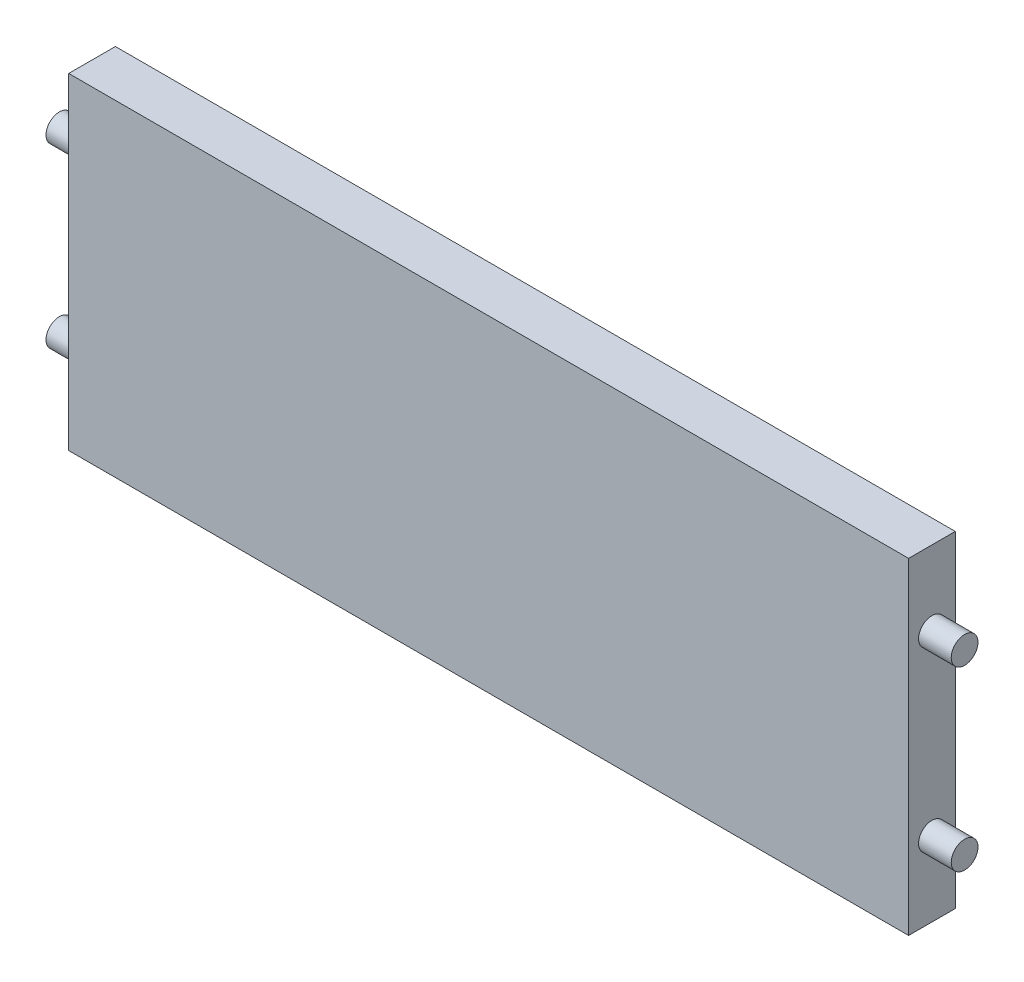
ISO-10303-21;
HEADER;
FILE_DESCRIPTION(('STEP AP214'),'2;1');
FILE_NAME('part.step','',(''),(''),'','','');
FILE_SCHEMA(('AUTOMOTIVE_DESIGN { 1 0 10303 214 1 1 1 1 }'));
ENDSEC;
DATA;
#1=APPLICATION_CONTEXT('core data for automotive mechanical design processes');
#2=APPLICATION_PROTOCOL_DEFINITION('international standard','automotive_design',2000,#1);
#3=PRODUCT_CONTEXT('',#1,'mechanical');
#4=PRODUCT('Part','Part','',(#3));
#5=PRODUCT_RELATED_PRODUCT_CATEGORY('part','',(#4));
#6=PRODUCT_DEFINITION_FORMATION('','',#4);
#7=PRODUCT_DEFINITION_CONTEXT('part definition',#1,'design');
#8=PRODUCT_DEFINITION('design','',#6,#7);
#9=PRODUCT_DEFINITION_SHAPE('','',#8);
#10=(LENGTH_UNIT() NAMED_UNIT(*) SI_UNIT(.MILLI.,.METRE.));
#11=(NAMED_UNIT(*) PLANE_ANGLE_UNIT() SI_UNIT($,.RADIAN.));
#12=(NAMED_UNIT(*) SI_UNIT($,.STERADIAN.) SOLID_ANGLE_UNIT());
#13=UNCERTAINTY_MEASURE_WITH_UNIT(LENGTH_MEASURE(1.E-05),#10,'distance_accuracy_value','');
#14=(GEOMETRIC_REPRESENTATION_CONTEXT(3) GLOBAL_UNCERTAINTY_ASSIGNED_CONTEXT((#13)) GLOBAL_UNIT_ASSIGNED_CONTEXT((#10,
#11,#12)) REPRESENTATION_CONTEXT('',''));
#15=CARTESIAN_POINT('',(0.,0.,0.));
#16=DIRECTION('',(0.,0.,1.));
#17=DIRECTION('',(1.,0.,0.));
#18=AXIS2_PLACEMENT_3D('',#15,#16,#17);
#19=CARTESIAN_POINT('',(0.,-17.5,5.));
#20=DIRECTION('',(0.,1.,0.));
#21=DIRECTION('',(0.,0.,1.));
#22=AXIS2_PLACEMENT_3D('',#19,#20,#21);
#23=PLANE('',#22);
#24=DIRECTION('',(1.,0.,0.));
#25=VECTOR('',#24,1.);
#26=CARTESIAN_POINT('',(0.,-17.5,0.));
#27=LINE('',#26,#25);
#28=CARTESIAN_POINT('',(-45.,-17.5,0.));
#29=VERTEX_POINT('',#28);
#30=CARTESIAN_POINT('',(45.,-17.5,0.));
#31=VERTEX_POINT('',#30);
#32=EDGE_CURVE('E117',#29,#31,#27,.T.);
#33=ORIENTED_EDGE('',*,*,#32,.T.);
#34=DIRECTION('',(0.,0.,-1.));
#35=VECTOR('',#34,1.);
#36=CARTESIAN_POINT('',(45.,-17.5,5.));
#37=LINE('',#36,#35);
#38=CARTESIAN_POINT('',(45.,-17.5,5.));
#39=VERTEX_POINT('',#38);
#40=EDGE_CURVE('E107',#39,#31,#37,.T.);
#41=ORIENTED_EDGE('',*,*,#40,.F.);
#42=DIRECTION('',(1.,0.,0.));
#43=VECTOR('',#42,1.);
#44=CARTESIAN_POINT('',(0.,-17.5,5.));
#45=LINE('',#44,#43);
#46=CARTESIAN_POINT('',(-45.,-17.5,5.));
#47=VERTEX_POINT('',#46);
#48=EDGE_CURVE('E96',#47,#39,#45,.T.);
#49=ORIENTED_EDGE('',*,*,#48,.F.);
#50=DIRECTION('',(0.,0.,-1.));
#51=VECTOR('',#50,1.);
#52=CARTESIAN_POINT('',(-45.,-17.5,5.));
#53=LINE('',#52,#51);
#54=EDGE_CURVE('E62',#47,#29,#53,.T.);
#55=ORIENTED_EDGE('',*,*,#54,.T.);
#56=EDGE_LOOP('',(#33,#41,#49,#55));
#57=FACE_BOUND('',#56,.T.);
#58=ADVANCED_FACE('F45',(#57),#23,.F.);
#59=CARTESIAN_POINT('',(45.,0.,5.));
#60=DIRECTION('',(-1.,0.,0.));
#61=DIRECTION('',(0.,0.,1.));
#62=AXIS2_PLACEMENT_3D('',#59,#60,#61);
#63=PLANE('',#62);
#64=CARTESIAN_POINT('',(45.,-9.5,2.5));
#65=DIRECTION('',(-1.,0.,0.));
#66=DIRECTION('',(0.,0.,1.));
#67=AXIS2_PLACEMENT_3D('',#64,#65,#66);
#68=CIRCLE('',#67,1.435);
#69=CARTESIAN_POINT('',(45.,-9.5,3.935));
#70=VERTEX_POINT('',#69);
#71=EDGE_CURVE('E11',#70,#70,#68,.F.);
#72=ORIENTED_EDGE('',*,*,#71,.F.);
#73=EDGE_LOOP('',(#72));
#74=FACE_BOUND('',#73,.T.);
#75=CARTESIAN_POINT('',(45.,9.5,2.5));
#76=DIRECTION('',(-1.,0.,0.));
#77=DIRECTION('',(0.,0.,1.));
#78=AXIS2_PLACEMENT_3D('',#75,#76,#77);
#79=CIRCLE('',#78,1.435);
#80=CARTESIAN_POINT('',(45.,9.5,3.935));
#81=VERTEX_POINT('',#80);
#82=EDGE_CURVE('E54',#81,#81,#79,.F.);
#83=ORIENTED_EDGE('',*,*,#82,.F.);
#84=EDGE_LOOP('',(#83));
#85=FACE_BOUND('',#84,.T.);
#86=DIRECTION('',(0.,1.,0.));
#87=VECTOR('',#86,1.);
#88=CARTESIAN_POINT('',(45.,0.,0.));
#89=LINE('',#88,#87);
#90=CARTESIAN_POINT('',(45.,17.5,0.));
#91=VERTEX_POINT('',#90);
#92=EDGE_CURVE('E103',#31,#91,#89,.T.);
#93=ORIENTED_EDGE('',*,*,#92,.T.);
#94=DIRECTION('',(0.,0.,-1.));
#95=VECTOR('',#94,1.);
#96=CARTESIAN_POINT('',(45.,17.5,5.));
#97=LINE('',#96,#95);
#98=CARTESIAN_POINT('',(45.,17.5,5.));
#99=VERTEX_POINT('',#98);
#100=EDGE_CURVE('E101',#99,#91,#97,.T.);
#101=ORIENTED_EDGE('',*,*,#100,.F.);
#102=DIRECTION('',(0.,1.,0.));
#103=VECTOR('',#102,1.);
#104=CARTESIAN_POINT('',(45.,0.,5.));
#105=LINE('',#104,#103);
#106=EDGE_CURVE('E88',#39,#99,#105,.T.);
#107=ORIENTED_EDGE('',*,*,#106,.F.);
#108=ORIENTED_EDGE('',*,*,#40,.T.);
#109=EDGE_LOOP('',(#93,#101,#107,#108));
#110=FACE_BOUND('',#109,.T.);
#111=ADVANCED_FACE('F102',(#74,#85,#110),#63,.F.);
#112=CARTESIAN_POINT('',(0.,17.5,5.));
#113=DIRECTION('',(0.,1.,0.));
#114=DIRECTION('',(0.,0.,1.));
#115=AXIS2_PLACEMENT_3D('',#112,#113,#114);
#116=PLANE('',#115);
#117=DIRECTION('',(1.,0.,0.));
#118=VECTOR('',#117,1.);
#119=CARTESIAN_POINT('',(0.,17.5,0.));
#120=LINE('',#119,#118);
#121=CARTESIAN_POINT('',(-45.,17.5,0.));
#122=VERTEX_POINT('',#121);
#123=EDGE_CURVE('E123',#122,#91,#120,.T.);
#124=ORIENTED_EDGE('',*,*,#123,.F.);
#125=DIRECTION('',(0.,0.,-1.));
#126=VECTOR('',#125,1.);
#127=CARTESIAN_POINT('',(-45.,17.5,5.));
#128=LINE('',#127,#126);
#129=CARTESIAN_POINT('',(-45.,17.5,5.));
#130=VERTEX_POINT('',#129);
#131=EDGE_CURVE('E76',#130,#122,#128,.T.);
#132=ORIENTED_EDGE('',*,*,#131,.F.);
#133=DIRECTION('',(1.,0.,0.));
#134=VECTOR('',#133,1.);
#135=CARTESIAN_POINT('',(0.,17.5,5.));
#136=LINE('',#135,#134);
#137=EDGE_CURVE('E95',#130,#99,#136,.T.);
#138=ORIENTED_EDGE('',*,*,#137,.T.);
#139=ORIENTED_EDGE('',*,*,#100,.T.);
#140=EDGE_LOOP('',(#124,#132,#138,#139));
#141=FACE_BOUND('',#140,.T.);
#142=ADVANCED_FACE('F109',(#141),#116,.T.);
#143=CARTESIAN_POINT('',(-45.,0.,5.));
#144=DIRECTION('',(-1.,0.,0.));
#145=DIRECTION('',(0.,0.,1.));
#146=AXIS2_PLACEMENT_3D('',#143,#144,#145);
#147=PLANE('',#146);
#148=CARTESIAN_POINT('',(-45.,-9.5,2.5));
#149=DIRECTION('',(-1.,0.,0.));
#150=DIRECTION('',(0.,0.,-1.));
#151=AXIS2_PLACEMENT_3D('',#148,#149,#150);
#152=CIRCLE('',#151,1.435);
#153=CARTESIAN_POINT('',(-45.,-9.5,1.065));
#154=VERTEX_POINT('',#153);
#155=EDGE_CURVE('E198',#154,#154,#152,.T.);
#156=ORIENTED_EDGE('',*,*,#155,.F.);
#157=EDGE_LOOP('',(#156));
#158=FACE_BOUND('',#157,.T.);
#159=CARTESIAN_POINT('',(-45.,9.5,2.5));
#160=DIRECTION('',(-1.,0.,0.));
#161=DIRECTION('',(0.,0.,1.));
#162=AXIS2_PLACEMENT_3D('',#159,#160,#161);
#163=CIRCLE('',#162,1.435);
#164=CARTESIAN_POINT('',(-45.,9.5,3.935));
#165=VERTEX_POINT('',#164);
#166=EDGE_CURVE('E200',#165,#165,#163,.T.);
#167=ORIENTED_EDGE('',*,*,#166,.F.);
#168=EDGE_LOOP('',(#167));
#169=FACE_BOUND('',#168,.T.);
#170=DIRECTION('',(0.,1.,0.));
#171=VECTOR('',#170,1.);
#172=CARTESIAN_POINT('',(-45.,0.,0.));
#173=LINE('',#172,#171);
#174=EDGE_CURVE('E126',#29,#122,#173,.T.);
#175=ORIENTED_EDGE('',*,*,#174,.F.);
#176=ORIENTED_EDGE('',*,*,#54,.F.);
#177=DIRECTION('',(0.,1.,0.));
#178=VECTOR('',#177,1.);
#179=CARTESIAN_POINT('',(-45.,0.,5.));
#180=LINE('',#179,#178);
#181=EDGE_CURVE('E111',#47,#130,#180,.T.);
#182=ORIENTED_EDGE('',*,*,#181,.T.);
#183=ORIENTED_EDGE('',*,*,#131,.T.);
#184=EDGE_LOOP('',(#175,#176,#182,#183));
#185=FACE_BOUND('',#184,.T.);
#186=ADVANCED_FACE('F147',(#158,#169,#185),#147,.T.);
#187=CARTESIAN_POINT('',(0.,0.,5.));
#188=DIRECTION('',(0.,0.,1.));
#189=DIRECTION('',(1.,0.,0.));
#190=AXIS2_PLACEMENT_3D('',#187,#188,#189);
#191=PLANE('',#190);
#192=ORIENTED_EDGE('',*,*,#48,.T.);
#193=ORIENTED_EDGE('',*,*,#106,.T.);
#194=ORIENTED_EDGE('',*,*,#137,.F.);
#195=ORIENTED_EDGE('',*,*,#181,.F.);
#196=EDGE_LOOP('',(#192,#193,#194,#195));
#197=FACE_BOUND('',#196,.T.);
#198=ADVANCED_FACE('F92',(#197),#191,.T.);
#199=CARTESIAN_POINT('',(0.,0.,0.));
#200=DIRECTION('',(0.,0.,1.));
#201=DIRECTION('',(1.,0.,0.));
#202=AXIS2_PLACEMENT_3D('',#199,#200,#201);
#203=PLANE('',#202);
#204=ORIENTED_EDGE('',*,*,#32,.F.);
#205=ORIENTED_EDGE('',*,*,#174,.T.);
#206=ORIENTED_EDGE('',*,*,#123,.T.);
#207=ORIENTED_EDGE('',*,*,#92,.F.);
#208=EDGE_LOOP('',(#204,#205,#206,#207));
#209=FACE_BOUND('',#208,.T.);
#210=ADVANCED_FACE('F154',(#209),#203,.F.);
#211=CARTESIAN_POINT('',(48.5,9.5,2.5));
#212=DIRECTION('',(-1.,0.,0.));
#213=DIRECTION('',(0.,0.,1.));
#214=AXIS2_PLACEMENT_3D('',#211,#212,#213);
#215=CYLINDRICAL_SURFACE('',#214,1.435);
#216=CARTESIAN_POINT('',(48.5,9.5,2.5));
#217=DIRECTION('',(1.,0.,0.));
#218=DIRECTION('',(0.,0.,-1.));
#219=AXIS2_PLACEMENT_3D('',#216,#217,#218);
#220=CIRCLE('',#219,1.435);
#221=CARTESIAN_POINT('',(48.5,9.5,1.065));
#222=VERTEX_POINT('',#221);
#223=EDGE_CURVE('E120',#222,#222,#220,.T.);
#224=ORIENTED_EDGE('',*,*,#223,.F.);
#225=EDGE_LOOP('',(#224));
#226=FACE_BOUND('',#225,.T.);
#227=ORIENTED_EDGE('',*,*,#82,.T.);
#228=EDGE_LOOP('',(#227));
#229=FACE_BOUND('',#228,.T.);
#230=ADVANCED_FACE('F139',(#226,#229),#215,.T.);
#231=CARTESIAN_POINT('',(48.5,9.5,2.5));
#232=DIRECTION('',(1.,0.,0.));
#233=DIRECTION('',(0.,0.,-1.));
#234=AXIS2_PLACEMENT_3D('',#231,#232,#233);
#235=PLANE('',#234);
#236=ORIENTED_EDGE('',*,*,#223,.T.);
#237=EDGE_LOOP('',(#236));
#238=FACE_BOUND('',#237,.T.);
#239=ADVANCED_FACE('F162',(#238),#235,.T.);
#240=CARTESIAN_POINT('',(48.5,-9.5,2.5));
#241=DIRECTION('',(-1.,0.,0.));
#242=DIRECTION('',(0.,0.,1.));
#243=AXIS2_PLACEMENT_3D('',#240,#241,#242);
#244=CYLINDRICAL_SURFACE('',#243,1.435);
#245=CARTESIAN_POINT('',(48.5,-9.5,2.5));
#246=DIRECTION('',(1.,0.,0.));
#247=DIRECTION('',(0.,0.,1.));
#248=AXIS2_PLACEMENT_3D('',#245,#246,#247);
#249=CIRCLE('',#248,1.435);
#250=CARTESIAN_POINT('',(48.5,-9.5,3.935));
#251=VERTEX_POINT('',#250);
#252=EDGE_CURVE('E211',#251,#251,#249,.T.);
#253=ORIENTED_EDGE('',*,*,#252,.F.);
#254=EDGE_LOOP('',(#253));
#255=FACE_BOUND('',#254,.T.);
#256=ORIENTED_EDGE('',*,*,#71,.T.);
#257=EDGE_LOOP('',(#256));
#258=FACE_BOUND('',#257,.T.);
#259=ADVANCED_FACE('F166',(#255,#258),#244,.T.);
#260=CARTESIAN_POINT('',(48.5,-9.5,2.5));
#261=DIRECTION('',(-1.,0.,0.));
#262=DIRECTION('',(0.,0.,1.));
#263=AXIS2_PLACEMENT_3D('',#260,#261,#262);
#264=PLANE('',#263);
#265=ORIENTED_EDGE('',*,*,#252,.T.);
#266=EDGE_LOOP('',(#265));
#267=FACE_BOUND('',#266,.T.);
#268=ADVANCED_FACE('F168',(#267),#264,.F.);
#269=CARTESIAN_POINT('',(-48.5,9.5,2.5));
#270=DIRECTION('',(1.,0.,0.));
#271=DIRECTION('',(0.,0.,-1.));
#272=AXIS2_PLACEMENT_3D('',#269,#270,#271);
#273=CYLINDRICAL_SURFACE('',#272,1.435);
#274=CARTESIAN_POINT('',(-48.5,9.5,2.5));
#275=DIRECTION('',(-1.,0.,0.));
#276=DIRECTION('',(0.,0.,1.));
#277=AXIS2_PLACEMENT_3D('',#274,#275,#276);
#278=CIRCLE('',#277,1.435);
#279=CARTESIAN_POINT('',(-48.5,9.5,3.935));
#280=VERTEX_POINT('',#279);
#281=EDGE_CURVE('E205',#280,#280,#278,.T.);
#282=ORIENTED_EDGE('',*,*,#281,.F.);
#283=EDGE_LOOP('',(#282));
#284=FACE_BOUND('',#283,.T.);
#285=ORIENTED_EDGE('',*,*,#166,.T.);
#286=EDGE_LOOP('',(#285));
#287=FACE_BOUND('',#286,.T.);
#288=ADVANCED_FACE('F171',(#284,#287),#273,.T.);
#289=CARTESIAN_POINT('',(-48.5,9.5,2.5));
#290=DIRECTION('',(-1.,0.,0.));
#291=DIRECTION('',(0.,0.,1.));
#292=AXIS2_PLACEMENT_3D('',#289,#290,#291);
#293=PLANE('',#292);
#294=ORIENTED_EDGE('',*,*,#281,.T.);
#295=EDGE_LOOP('',(#294));
#296=FACE_BOUND('',#295,.T.);
#297=ADVANCED_FACE('F178',(#296),#293,.T.);
#298=CARTESIAN_POINT('',(-48.5,-9.5,2.5));
#299=DIRECTION('',(1.,0.,0.));
#300=DIRECTION('',(0.,0.,-1.));
#301=AXIS2_PLACEMENT_3D('',#298,#299,#300);
#302=CYLINDRICAL_SURFACE('',#301,1.435);
#303=CARTESIAN_POINT('',(-48.5,-9.5,2.5));
#304=DIRECTION('',(-1.,0.,0.));
#305=DIRECTION('',(0.,0.,-1.));
#306=AXIS2_PLACEMENT_3D('',#303,#304,#305);
#307=CIRCLE('',#306,1.435);
#308=CARTESIAN_POINT('',(-48.5,-9.5,1.065));
#309=VERTEX_POINT('',#308);
#310=EDGE_CURVE('E195',#309,#309,#307,.T.);
#311=ORIENTED_EDGE('',*,*,#310,.F.);
#312=EDGE_LOOP('',(#311));
#313=FACE_BOUND('',#312,.T.);
#314=ORIENTED_EDGE('',*,*,#155,.T.);
#315=EDGE_LOOP('',(#314));
#316=FACE_BOUND('',#315,.T.);
#317=ADVANCED_FACE('F182',(#313,#316),#302,.T.);
#318=CARTESIAN_POINT('',(-48.5,-9.5,2.5));
#319=DIRECTION('',(1.,0.,0.));
#320=DIRECTION('',(0.,0.,-1.));
#321=AXIS2_PLACEMENT_3D('',#318,#319,#320);
#322=PLANE('',#321);
#323=ORIENTED_EDGE('',*,*,#310,.T.);
#324=EDGE_LOOP('',(#323));
#325=FACE_BOUND('',#324,.T.);
#326=ADVANCED_FACE('F184',(#325),#322,.F.);
#327=CLOSED_SHELL('',(#58,#111,#142,#186,#198,#210,#230,#239,#259,#268,#288,#297,#317,#326));
#328=MANIFOLD_SOLID_BREP('B2',#327);
#329=ADVANCED_BREP_SHAPE_REPRESENTATION('',(#18,#328),#14);
#330=SHAPE_DEFINITION_REPRESENTATION(#9,#329);
ENDSEC;
END-ISO-10303-21;
